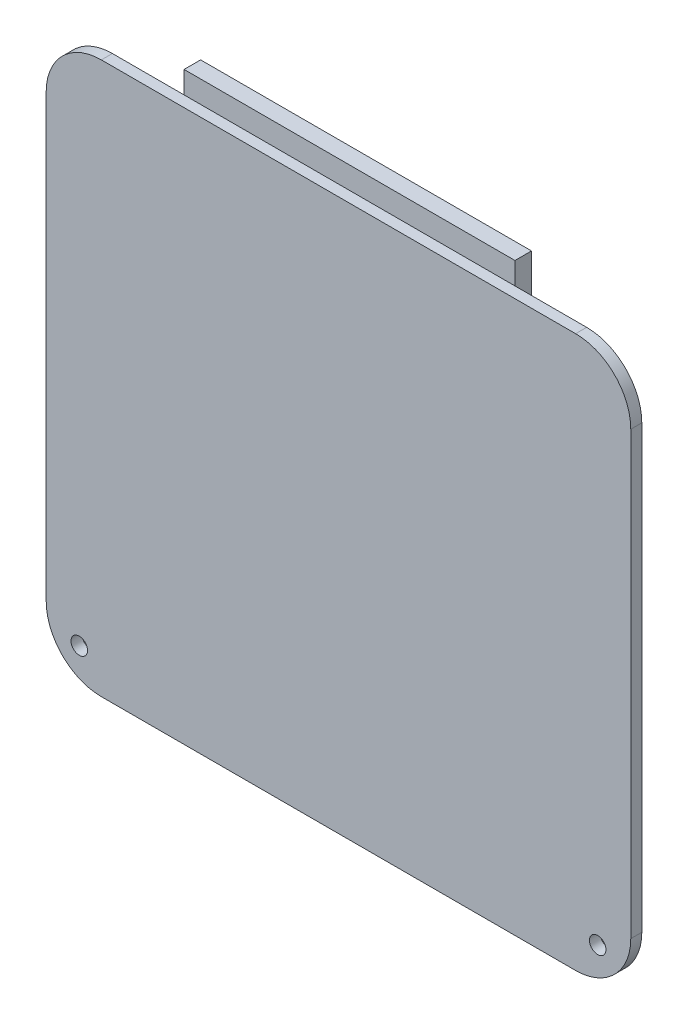
ISO-10303-21;
HEADER;
FILE_DESCRIPTION(('STEP AP214'),'2;1');
FILE_NAME('part.step','',(''),(''),'','','');
FILE_SCHEMA(('AUTOMOTIVE_DESIGN { 1 0 10303 214 1 1 1 1 }'));
ENDSEC;
DATA;
#1=APPLICATION_CONTEXT('core data for automotive mechanical design processes');
#2=APPLICATION_PROTOCOL_DEFINITION('international standard','automotive_design',2000,#1);
#3=PRODUCT_CONTEXT('',#1,'mechanical');
#4=PRODUCT('Part','Part','',(#3));
#5=PRODUCT_RELATED_PRODUCT_CATEGORY('part','',(#4));
#6=PRODUCT_DEFINITION_FORMATION('','',#4);
#7=PRODUCT_DEFINITION_CONTEXT('part definition',#1,'design');
#8=PRODUCT_DEFINITION('design','',#6,#7);
#9=PRODUCT_DEFINITION_SHAPE('','',#8);
#10=(LENGTH_UNIT() NAMED_UNIT(*) SI_UNIT(.MILLI.,.METRE.));
#11=(NAMED_UNIT(*) PLANE_ANGLE_UNIT() SI_UNIT($,.RADIAN.));
#12=(NAMED_UNIT(*) SI_UNIT($,.STERADIAN.) SOLID_ANGLE_UNIT());
#13=UNCERTAINTY_MEASURE_WITH_UNIT(LENGTH_MEASURE(1.E-05),#10,'distance_accuracy_value','');
#14=(GEOMETRIC_REPRESENTATION_CONTEXT(3) GLOBAL_UNCERTAINTY_ASSIGNED_CONTEXT((#13)) GLOBAL_UNIT_ASSIGNED_CONTEXT((#10,
#11,#12)) REPRESENTATION_CONTEXT('',''));
#15=CARTESIAN_POINT('',(0.,0.,0.));
#16=DIRECTION('',(0.,0.,1.));
#17=DIRECTION('',(1.,0.,0.));
#18=AXIS2_PLACEMENT_3D('',#15,#16,#17);
#19=CARTESIAN_POINT('',(-43.0000000000001,270.,-2.));
#20=DIRECTION('',(0.,0.,1.));
#21=DIRECTION('',(1.,0.,0.));
#22=AXIS2_PLACEMENT_3D('',#19,#20,#21);
#23=PLANE('',#22);
#24=CARTESIAN_POINT('',(-47.0000000000002,266.,-2.));
#25=DIRECTION('',(0.,0.,-1.));
#26=DIRECTION('',(1.,0.,0.));
#27=AXIS2_PLACEMENT_3D('',#24,#25,#26);
#28=CIRCLE('',#27,1.5);
#29=CARTESIAN_POINT('',(-45.5000000000002,266.,-2.));
#30=VERTEX_POINT('',#29);
#31=EDGE_CURVE('E167',#30,#30,#28,.T.);
#32=ORIENTED_EDGE('',*,*,#31,.F.);
#33=EDGE_LOOP('',(#32));
#34=FACE_BOUND('',#33,.T.);
#35=CARTESIAN_POINT('',(47.,266.,-2.));
#36=DIRECTION('',(0.,0.,-1.));
#37=DIRECTION('',(1.,0.,0.));
#38=AXIS2_PLACEMENT_3D('',#35,#36,#37);
#39=CIRCLE('',#38,1.5);
#40=CARTESIAN_POINT('',(48.5,266.,-2.));
#41=VERTEX_POINT('',#40);
#42=EDGE_CURVE('E170',#41,#41,#39,.T.);
#43=ORIENTED_EDGE('',*,*,#42,.F.);
#44=EDGE_LOOP('',(#43));
#45=FACE_BOUND('',#44,.T.);
#46=DIRECTION('',(-1.,0.,0.));
#47=VECTOR('',#46,1.);
#48=CARTESIAN_POINT('',(30.,348.25735931288,-2.));
#49=LINE('',#48,#47);
#50=CARTESIAN_POINT('',(-30.,348.25735931288,-2.));
#51=VERTEX_POINT('',#50);
#52=CARTESIAN_POINT('',(30.,348.25735931288,-2.));
#53=VERTEX_POINT('',#52);
#54=EDGE_CURVE('E255',#51,#53,#49,.F.);
#55=ORIENTED_EDGE('',*,*,#54,.T.);
#56=DIRECTION('',(0.,-1.,0.));
#57=VECTOR('',#56,1.);
#58=CARTESIAN_POINT('',(30.,352.5,-2.));
#59=LINE('',#58,#57);
#60=CARTESIAN_POINT('',(30.,360.,-2.));
#61=VERTEX_POINT('',#60);
#62=EDGE_CURVE('E232',#61,#53,#59,.T.);
#63=ORIENTED_EDGE('',*,*,#62,.F.);
#64=DIRECTION('',(-1.,0.,0.));
#65=VECTOR('',#64,1.);
#66=CARTESIAN_POINT('',(43.,360.,-2.));
#67=LINE('',#66,#65);
#68=CARTESIAN_POINT('',(43.,360.,-2.));
#69=VERTEX_POINT('',#68);
#70=EDGE_CURVE('E195',#69,#61,#67,.T.);
#71=ORIENTED_EDGE('',*,*,#70,.F.);
#72=CARTESIAN_POINT('',(43.,350.,-2.));
#73=DIRECTION('',(0.,0.,1.));
#74=DIRECTION('',(1.,0.,0.));
#75=AXIS2_PLACEMENT_3D('',#72,#73,#74);
#76=CIRCLE('',#75,10.);
#77=CARTESIAN_POINT('',(53.,350.,-2.));
#78=VERTEX_POINT('',#77);
#79=EDGE_CURVE('E191',#78,#69,#76,.T.);
#80=ORIENTED_EDGE('',*,*,#79,.F.);
#81=DIRECTION('',(0.,1.,0.));
#82=VECTOR('',#81,1.);
#83=CARTESIAN_POINT('',(53.,270.,-2.));
#84=LINE('',#83,#82);
#85=CARTESIAN_POINT('',(53.,270.,-2.));
#86=VERTEX_POINT('',#85);
#87=EDGE_CURVE('E188',#86,#78,#84,.T.);
#88=ORIENTED_EDGE('',*,*,#87,.F.);
#89=CARTESIAN_POINT('',(43.,270.,-2.));
#90=DIRECTION('',(0.,0.,1.));
#91=DIRECTION('',(1.,0.,0.));
#92=AXIS2_PLACEMENT_3D('',#89,#90,#91);
#93=CIRCLE('',#92,10.);
#94=CARTESIAN_POINT('',(43.,260.,-2.));
#95=VERTEX_POINT('',#94);
#96=EDGE_CURVE('E185',#95,#86,#93,.T.);
#97=ORIENTED_EDGE('',*,*,#96,.F.);
#98=DIRECTION('',(1.,0.,0.));
#99=VECTOR('',#98,1.);
#100=CARTESIAN_POINT('',(-43.0000000000001,260.,-2.));
#101=LINE('',#100,#99);
#102=CARTESIAN_POINT('',(-43.0000000000001,260.,-2.));
#103=VERTEX_POINT('',#102);
#104=EDGE_CURVE('E181',#103,#95,#101,.T.);
#105=ORIENTED_EDGE('',*,*,#104,.F.);
#106=CARTESIAN_POINT('',(-43.0000000000001,270.,-2.));
#107=DIRECTION('',(0.,0.,1.));
#108=DIRECTION('',(1.,0.,0.));
#109=AXIS2_PLACEMENT_3D('',#106,#107,#108);
#110=CIRCLE('',#109,10.);
#111=CARTESIAN_POINT('',(-53.0000000000001,270.,-2.));
#112=VERTEX_POINT('',#111);
#113=EDGE_CURVE('E178',#112,#103,#110,.T.);
#114=ORIENTED_EDGE('',*,*,#113,.F.);
#115=DIRECTION('',(0.,-1.,0.));
#116=VECTOR('',#115,1.);
#117=CARTESIAN_POINT('',(-53.0000000000001,350.,-2.));
#118=LINE('',#117,#116);
#119=CARTESIAN_POINT('',(-53.0000000000001,350.,-2.));
#120=VERTEX_POINT('',#119);
#121=EDGE_CURVE('E202',#120,#112,#118,.T.);
#122=ORIENTED_EDGE('',*,*,#121,.F.);
#123=CARTESIAN_POINT('',(-43.0000000000001,350.,-2.));
#124=DIRECTION('',(0.,0.,1.));
#125=DIRECTION('',(1.,0.,0.));
#126=AXIS2_PLACEMENT_3D('',#123,#124,#125);
#127=CIRCLE('',#126,10.);
#128=CARTESIAN_POINT('',(-43.0000000000001,360.,-2.));
#129=VERTEX_POINT('',#128);
#130=EDGE_CURVE('E198',#129,#120,#127,.T.);
#131=ORIENTED_EDGE('',*,*,#130,.F.);
#132=CARTESIAN_POINT('',(-30.,360.,-2.));
#133=VERTEX_POINT('',#132);
#134=EDGE_CURVE('E194',#133,#129,#67,.T.);
#135=ORIENTED_EDGE('',*,*,#134,.F.);
#136=DIRECTION('',(0.,1.,0.));
#137=VECTOR('',#136,1.);
#138=CARTESIAN_POINT('',(-30.,364.,-2.));
#139=LINE('',#138,#137);
#140=EDGE_CURVE('E276',#51,#133,#139,.T.);
#141=ORIENTED_EDGE('',*,*,#140,.F.);
#142=EDGE_LOOP('',(#55,#63,#71,#80,#88,#97,#105,#114,#122,#131,#135,#141));
#143=FACE_BOUND('',#142,.T.);
#144=ADVANCED_FACE('F35',(#34,#45,#143),#23,.F.);
#145=CARTESIAN_POINT('',(-43.0000000000001,270.,-2.));
#146=DIRECTION('',(0.,0.,1.));
#147=DIRECTION('',(1.,0.,0.));
#148=AXIS2_PLACEMENT_3D('',#145,#146,#147);
#149=CYLINDRICAL_SURFACE('',#148,10.);
#150=CARTESIAN_POINT('',(-43.0000000000001,270.,0.));
#151=DIRECTION('',(0.,0.,1.));
#152=DIRECTION('',(1.,0.,0.));
#153=AXIS2_PLACEMENT_3D('',#150,#151,#152);
#154=CIRCLE('',#153,10.);
#155=CARTESIAN_POINT('',(-53.0000000000001,270.,0.));
#156=VERTEX_POINT('',#155);
#157=CARTESIAN_POINT('',(-43.0000000000001,260.,0.));
#158=VERTEX_POINT('',#157);
#159=EDGE_CURVE('E206',#156,#158,#154,.T.);
#160=ORIENTED_EDGE('',*,*,#159,.F.);
#161=DIRECTION('',(0.,0.,1.));
#162=VECTOR('',#161,1.);
#163=CARTESIAN_POINT('',(-53.0000000000001,270.,-2.));
#164=LINE('',#163,#162);
#165=EDGE_CURVE('E230',#112,#156,#164,.T.);
#166=ORIENTED_EDGE('',*,*,#165,.F.);
#167=ORIENTED_EDGE('',*,*,#113,.T.);
#168=DIRECTION('',(0.,0.,1.));
#169=VECTOR('',#168,1.);
#170=CARTESIAN_POINT('',(-43.0000000000001,260.,-2.));
#171=LINE('',#170,#169);
#172=EDGE_CURVE('E205',#103,#158,#171,.T.);
#173=ORIENTED_EDGE('',*,*,#172,.T.);
#174=EDGE_LOOP('',(#160,#166,#167,#173));
#175=FACE_BOUND('',#174,.T.);
#176=ADVANCED_FACE('F282',(#175),#149,.T.);
#177=CARTESIAN_POINT('',(-53.0000000000001,350.,-2.));
#178=DIRECTION('',(-1.,0.,0.));
#179=DIRECTION('',(0.,-1.,0.));
#180=AXIS2_PLACEMENT_3D('',#177,#178,#179);
#181=PLANE('',#180);
#182=DIRECTION('',(0.,-1.,0.));
#183=VECTOR('',#182,1.);
#184=CARTESIAN_POINT('',(-53.0000000000001,350.,0.));
#185=LINE('',#184,#183);
#186=CARTESIAN_POINT('',(-53.0000000000001,350.,0.));
#187=VERTEX_POINT('',#186);
#188=EDGE_CURVE('E182',#187,#156,#185,.T.);
#189=ORIENTED_EDGE('',*,*,#188,.F.);
#190=DIRECTION('',(0.,0.,1.));
#191=VECTOR('',#190,1.);
#192=CARTESIAN_POINT('',(-53.0000000000001,350.,-2.));
#193=LINE('',#192,#191);
#194=EDGE_CURVE('E233',#120,#187,#193,.T.);
#195=ORIENTED_EDGE('',*,*,#194,.F.);
#196=ORIENTED_EDGE('',*,*,#121,.T.);
#197=ORIENTED_EDGE('',*,*,#165,.T.);
#198=EDGE_LOOP('',(#189,#195,#196,#197));
#199=FACE_BOUND('',#198,.T.);
#200=ADVANCED_FACE('F290',(#199),#181,.T.);
#201=CARTESIAN_POINT('',(-43.0000000000001,350.,-2.));
#202=DIRECTION('',(0.,0.,1.));
#203=DIRECTION('',(1.,0.,0.));
#204=AXIS2_PLACEMENT_3D('',#201,#202,#203);
#205=CYLINDRICAL_SURFACE('',#204,10.);
#206=CARTESIAN_POINT('',(-43.0000000000001,350.,0.));
#207=DIRECTION('',(0.,0.,1.));
#208=DIRECTION('',(1.,0.,0.));
#209=AXIS2_PLACEMENT_3D('',#206,#207,#208);
#210=CIRCLE('',#209,10.);
#211=CARTESIAN_POINT('',(-43.0000000000001,360.,0.));
#212=VERTEX_POINT('',#211);
#213=EDGE_CURVE('E225',#212,#187,#210,.T.);
#214=ORIENTED_EDGE('',*,*,#213,.F.);
#215=DIRECTION('',(0.,0.,1.));
#216=VECTOR('',#215,1.);
#217=CARTESIAN_POINT('',(-43.0000000000001,360.,-2.));
#218=LINE('',#217,#216);
#219=EDGE_CURVE('E235',#129,#212,#218,.T.);
#220=ORIENTED_EDGE('',*,*,#219,.F.);
#221=ORIENTED_EDGE('',*,*,#130,.T.);
#222=ORIENTED_EDGE('',*,*,#194,.T.);
#223=EDGE_LOOP('',(#214,#220,#221,#222));
#224=FACE_BOUND('',#223,.T.);
#225=ADVANCED_FACE('F306',(#224),#205,.T.);
#226=CARTESIAN_POINT('',(43.,360.,-2.));
#227=DIRECTION('',(0.,1.,0.));
#228=DIRECTION('',(0.,0.,1.));
#229=AXIS2_PLACEMENT_3D('',#226,#227,#228);
#230=PLANE('',#229);
#231=DIRECTION('',(-1.,0.,0.));
#232=VECTOR('',#231,1.);
#233=CARTESIAN_POINT('',(43.,360.,0.));
#234=LINE('',#233,#232);
#235=CARTESIAN_POINT('',(43.,360.,0.));
#236=VERTEX_POINT('',#235);
#237=EDGE_CURVE('E222',#236,#212,#234,.T.);
#238=ORIENTED_EDGE('',*,*,#237,.F.);
#239=DIRECTION('',(0.,0.,1.));
#240=VECTOR('',#239,1.);
#241=CARTESIAN_POINT('',(43.,360.,-2.));
#242=LINE('',#241,#240);
#243=EDGE_CURVE('E237',#69,#236,#242,.T.);
#244=ORIENTED_EDGE('',*,*,#243,.F.);
#245=ORIENTED_EDGE('',*,*,#70,.T.);
#246=EDGE_CURVE('E199',#61,#133,#67,.T.);
#247=ORIENTED_EDGE('',*,*,#246,.T.);
#248=ORIENTED_EDGE('',*,*,#134,.T.);
#249=ORIENTED_EDGE('',*,*,#219,.T.);
#250=EDGE_LOOP('',(#238,#244,#245,#247,#248,#249));
#251=FACE_BOUND('',#250,.T.);
#252=ADVANCED_FACE('F310',(#251),#230,.T.);
#253=CARTESIAN_POINT('',(43.,350.,-2.));
#254=DIRECTION('',(0.,0.,1.));
#255=DIRECTION('',(1.,0.,0.));
#256=AXIS2_PLACEMENT_3D('',#253,#254,#255);
#257=CYLINDRICAL_SURFACE('',#256,10.);
#258=CARTESIAN_POINT('',(43.,350.,0.));
#259=DIRECTION('',(0.,0.,1.));
#260=DIRECTION('',(1.,0.,0.));
#261=AXIS2_PLACEMENT_3D('',#258,#259,#260);
#262=CIRCLE('',#261,10.);
#263=CARTESIAN_POINT('',(53.,350.,0.));
#264=VERTEX_POINT('',#263);
#265=EDGE_CURVE('E219',#264,#236,#262,.T.);
#266=ORIENTED_EDGE('',*,*,#265,.F.);
#267=DIRECTION('',(0.,0.,1.));
#268=VECTOR('',#267,1.);
#269=CARTESIAN_POINT('',(53.,350.,-2.));
#270=LINE('',#269,#268);
#271=EDGE_CURVE('E239',#78,#264,#270,.T.);
#272=ORIENTED_EDGE('',*,*,#271,.F.);
#273=ORIENTED_EDGE('',*,*,#79,.T.);
#274=ORIENTED_EDGE('',*,*,#243,.T.);
#275=EDGE_LOOP('',(#266,#272,#273,#274));
#276=FACE_BOUND('',#275,.T.);
#277=ADVANCED_FACE('F314',(#276),#257,.T.);
#278=CARTESIAN_POINT('',(53.,270.,-2.));
#279=DIRECTION('',(1.,0.,0.));
#280=DIRECTION('',(0.,1.,0.));
#281=AXIS2_PLACEMENT_3D('',#278,#279,#280);
#282=PLANE('',#281);
#283=DIRECTION('',(0.,1.,0.));
#284=VECTOR('',#283,1.);
#285=CARTESIAN_POINT('',(53.,270.,0.));
#286=LINE('',#285,#284);
#287=CARTESIAN_POINT('',(53.,270.,0.));
#288=VERTEX_POINT('',#287);
#289=EDGE_CURVE('E216',#288,#264,#286,.T.);
#290=ORIENTED_EDGE('',*,*,#289,.F.);
#291=DIRECTION('',(0.,0.,1.));
#292=VECTOR('',#291,1.);
#293=CARTESIAN_POINT('',(53.,270.,-2.));
#294=LINE('',#293,#292);
#295=EDGE_CURVE('E241',#86,#288,#294,.T.);
#296=ORIENTED_EDGE('',*,*,#295,.F.);
#297=ORIENTED_EDGE('',*,*,#87,.T.);
#298=ORIENTED_EDGE('',*,*,#271,.T.);
#299=EDGE_LOOP('',(#290,#296,#297,#298));
#300=FACE_BOUND('',#299,.T.);
#301=ADVANCED_FACE('F318',(#300),#282,.T.);
#302=CARTESIAN_POINT('',(43.,270.,-2.));
#303=DIRECTION('',(0.,0.,1.));
#304=DIRECTION('',(1.,0.,0.));
#305=AXIS2_PLACEMENT_3D('',#302,#303,#304);
#306=CYLINDRICAL_SURFACE('',#305,10.);
#307=CARTESIAN_POINT('',(43.,270.,0.));
#308=DIRECTION('',(0.,0.,1.));
#309=DIRECTION('',(1.,0.,0.));
#310=AXIS2_PLACEMENT_3D('',#307,#308,#309);
#311=CIRCLE('',#310,10.);
#312=CARTESIAN_POINT('',(43.,260.,0.));
#313=VERTEX_POINT('',#312);
#314=EDGE_CURVE('E213',#313,#288,#311,.T.);
#315=ORIENTED_EDGE('',*,*,#314,.F.);
#316=DIRECTION('',(0.,0.,1.));
#317=VECTOR('',#316,1.);
#318=CARTESIAN_POINT('',(43.,260.,-2.));
#319=LINE('',#318,#317);
#320=EDGE_CURVE('E243',#95,#313,#319,.T.);
#321=ORIENTED_EDGE('',*,*,#320,.F.);
#322=ORIENTED_EDGE('',*,*,#96,.T.);
#323=ORIENTED_EDGE('',*,*,#295,.T.);
#324=EDGE_LOOP('',(#315,#321,#322,#323));
#325=FACE_BOUND('',#324,.T.);
#326=ADVANCED_FACE('F322',(#325),#306,.T.);
#327=CARTESIAN_POINT('',(-43.0000000000001,260.,-2.));
#328=DIRECTION('',(0.,-1.,0.));
#329=DIRECTION('',(0.,0.,-1.));
#330=AXIS2_PLACEMENT_3D('',#327,#328,#329);
#331=PLANE('',#330);
#332=DIRECTION('',(1.,0.,0.));
#333=VECTOR('',#332,1.);
#334=CARTESIAN_POINT('',(-43.0000000000001,260.,0.));
#335=LINE('',#334,#333);
#336=EDGE_CURVE('E209',#158,#313,#335,.T.);
#337=ORIENTED_EDGE('',*,*,#336,.F.);
#338=ORIENTED_EDGE('',*,*,#172,.F.);
#339=ORIENTED_EDGE('',*,*,#104,.T.);
#340=ORIENTED_EDGE('',*,*,#320,.T.);
#341=EDGE_LOOP('',(#337,#338,#339,#340));
#342=FACE_BOUND('',#341,.T.);
#343=ADVANCED_FACE('F302',(#342),#331,.T.);
#344=CARTESIAN_POINT('',(-43.0000000000001,270.,0.));
#345=DIRECTION('',(0.,0.,1.));
#346=DIRECTION('',(1.,0.,0.));
#347=AXIS2_PLACEMENT_3D('',#344,#345,#346);
#348=PLANE('',#347);
#349=CARTESIAN_POINT('',(47.,266.,0.));
#350=DIRECTION('',(0.,0.,1.));
#351=DIRECTION('',(1.,0.,0.));
#352=AXIS2_PLACEMENT_3D('',#349,#350,#351);
#353=CIRCLE('',#352,1.5);
#354=CARTESIAN_POINT('',(48.5,266.,0.));
#355=VERTEX_POINT('',#354);
#356=EDGE_CURVE('E210',#355,#355,#353,.T.);
#357=ORIENTED_EDGE('',*,*,#356,.F.);
#358=EDGE_LOOP('',(#357));
#359=FACE_BOUND('',#358,.T.);
#360=CARTESIAN_POINT('',(-47.0000000000002,266.,0.));
#361=DIRECTION('',(0.,0.,1.));
#362=DIRECTION('',(1.,0.,0.));
#363=AXIS2_PLACEMENT_3D('',#360,#361,#362);
#364=CIRCLE('',#363,1.5);
#365=CARTESIAN_POINT('',(-45.5000000000002,266.,0.));
#366=VERTEX_POINT('',#365);
#367=EDGE_CURVE('E176',#366,#366,#364,.T.);
#368=ORIENTED_EDGE('',*,*,#367,.F.);
#369=EDGE_LOOP('',(#368));
#370=FACE_BOUND('',#369,.T.);
#371=ORIENTED_EDGE('',*,*,#159,.T.);
#372=ORIENTED_EDGE('',*,*,#336,.T.);
#373=ORIENTED_EDGE('',*,*,#314,.T.);
#374=ORIENTED_EDGE('',*,*,#289,.T.);
#375=ORIENTED_EDGE('',*,*,#265,.T.);
#376=ORIENTED_EDGE('',*,*,#237,.T.);
#377=ORIENTED_EDGE('',*,*,#213,.T.);
#378=ORIENTED_EDGE('',*,*,#188,.T.);
#379=EDGE_LOOP('',(#371,#372,#373,#374,#375,#376,#377,#378));
#380=FACE_BOUND('',#379,.T.);
#381=ADVANCED_FACE('F299',(#359,#370,#380),#348,.T.);
#382=CARTESIAN_POINT('',(-47.0000000000002,266.,1.));
#383=DIRECTION('',(0.,0.,-1.));
#384=DIRECTION('',(-1.,0.,0.));
#385=AXIS2_PLACEMENT_3D('',#382,#383,#384);
#386=CYLINDRICAL_SURFACE('',#385,1.5);
#387=ORIENTED_EDGE('',*,*,#367,.T.);
#388=EDGE_LOOP('',(#387));
#389=FACE_BOUND('',#388,.T.);
#390=ORIENTED_EDGE('',*,*,#31,.T.);
#391=EDGE_LOOP('',(#390));
#392=FACE_BOUND('',#391,.T.);
#393=ADVANCED_FACE('F297',(#389,#392),#386,.F.);
#394=CARTESIAN_POINT('',(47.,266.,1.));
#395=DIRECTION('',(0.,0.,-1.));
#396=DIRECTION('',(-1.,0.,0.));
#397=AXIS2_PLACEMENT_3D('',#394,#395,#396);
#398=CYLINDRICAL_SURFACE('',#397,1.5);
#399=ORIENTED_EDGE('',*,*,#356,.T.);
#400=EDGE_LOOP('',(#399));
#401=FACE_BOUND('',#400,.T.);
#402=ORIENTED_EDGE('',*,*,#42,.T.);
#403=EDGE_LOOP('',(#402));
#404=FACE_BOUND('',#403,.T.);
#405=ADVANCED_FACE('F345',(#401,#404),#398,.F.);
#406=CARTESIAN_POINT('',(0.,0.,-2.));
#407=DIRECTION('',(0.,0.,1.));
#408=DIRECTION('',(1.,0.,0.));
#409=AXIS2_PLACEMENT_3D('',#406,#407,#408);
#410=PLANE('',#409);
#411=ORIENTED_EDGE('',*,*,#246,.F.);
#412=CARTESIAN_POINT('',(30.,364.,-2.));
#413=VERTEX_POINT('',#412);
#414=EDGE_CURVE('E152',#413,#61,#59,.T.);
#415=ORIENTED_EDGE('',*,*,#414,.F.);
#416=DIRECTION('',(1.,0.,0.));
#417=VECTOR('',#416,1.);
#418=CARTESIAN_POINT('',(30.,364.,-2.));
#419=LINE('',#418,#417);
#420=CARTESIAN_POINT('',(-30.,364.,-2.));
#421=VERTEX_POINT('',#420);
#422=EDGE_CURVE('E364',#421,#413,#419,.T.);
#423=ORIENTED_EDGE('',*,*,#422,.F.);
#424=EDGE_CURVE('E165',#133,#421,#139,.T.);
#425=ORIENTED_EDGE('',*,*,#424,.F.);
#426=EDGE_LOOP('',(#411,#415,#423,#425));
#427=FACE_BOUND('',#426,.T.);
#428=ADVANCED_FACE('F343',(#427),#410,.T.);
#429=CARTESIAN_POINT('',(-30.,364.,-5.));
#430=DIRECTION('',(1.,0.,0.));
#431=DIRECTION('',(0.,1.,0.));
#432=AXIS2_PLACEMENT_3D('',#429,#430,#431);
#433=PLANE('',#432);
#434=DIRECTION('',(0.,1.,0.));
#435=VECTOR('',#434,1.);
#436=CARTESIAN_POINT('',(-30.,364.,-5.));
#437=LINE('',#436,#435);
#438=CARTESIAN_POINT('',(-30.,353.742640687119,-5.));
#439=VERTEX_POINT('',#438);
#440=CARTESIAN_POINT('',(-30.,364.,-5.));
#441=VERTEX_POINT('',#440);
#442=EDGE_CURVE('E144',#439,#441,#437,.T.);
#443=ORIENTED_EDGE('',*,*,#442,.F.);
#444=CARTESIAN_POINT('',(-30.,353.742640687119,-2.));
#445=DIRECTION('',(1.,0.,0.));
#446=DIRECTION('',(0.,1.,0.));
#447=AXIS2_PLACEMENT_3D('',#444,#445,#446);
#448=CIRCLE('',#447,3.);
#449=CARTESIAN_POINT('',(-30.,351.621320343559,-4.12132034355964));
#450=VERTEX_POINT('',#449);
#451=EDGE_CURVE('E58',#439,#450,#448,.F.);
#452=ORIENTED_EDGE('',*,*,#451,.T.);
#453=DIRECTION('',(0.,0.707106781186548,-0.707106781186547));
#454=VECTOR('',#453,1.);
#455=CARTESIAN_POINT('',(-30.,358.25,-10.75));
#456=LINE('',#455,#454);
#457=CARTESIAN_POINT('',(-30.,350.37867965644,-2.87867965644033));
#458=VERTEX_POINT('',#457);
#459=EDGE_CURVE('E250',#450,#458,#456,.F.);
#460=ORIENTED_EDGE('',*,*,#459,.T.);
#461=CARTESIAN_POINT('',(-30.,348.25735931288,-5.));
#462=DIRECTION('',(1.,0.,0.));
#463=DIRECTION('',(0.,1.,0.));
#464=AXIS2_PLACEMENT_3D('',#461,#462,#463);
#465=CIRCLE('',#464,3.);
#466=EDGE_CURVE('E11',#458,#51,#465,.T.);
#467=ORIENTED_EDGE('',*,*,#466,.T.);
#468=ORIENTED_EDGE('',*,*,#140,.T.);
#469=ORIENTED_EDGE('',*,*,#424,.T.);
#470=DIRECTION('',(0.,0.,1.));
#471=VECTOR('',#470,1.);
#472=CARTESIAN_POINT('',(-30.,364.,-5.));
#473=LINE('',#472,#471);
#474=EDGE_CURVE('E157',#441,#421,#473,.T.);
#475=ORIENTED_EDGE('',*,*,#474,.F.);
#476=EDGE_LOOP('',(#443,#452,#460,#467,#468,#469,#475));
#477=FACE_BOUND('',#476,.T.);
#478=ADVANCED_FACE('F162',(#477),#433,.F.);
#479=CARTESIAN_POINT('',(30.,364.,-5.));
#480=DIRECTION('',(0.,-1.,0.));
#481=DIRECTION('',(0.,0.,-1.));
#482=AXIS2_PLACEMENT_3D('',#479,#480,#481);
#483=PLANE('',#482);
#484=ORIENTED_EDGE('',*,*,#422,.T.);
#485=DIRECTION('',(0.,0.,1.));
#486=VECTOR('',#485,1.);
#487=CARTESIAN_POINT('',(30.,364.,-5.));
#488=LINE('',#487,#486);
#489=CARTESIAN_POINT('',(30.,364.,-5.));
#490=VERTEX_POINT('',#489);
#491=EDGE_CURVE('E159',#490,#413,#488,.T.);
#492=ORIENTED_EDGE('',*,*,#491,.F.);
#493=DIRECTION('',(1.,0.,0.));
#494=VECTOR('',#493,1.);
#495=CARTESIAN_POINT('',(30.,364.,-5.));
#496=LINE('',#495,#494);
#497=EDGE_CURVE('E147',#441,#490,#496,.T.);
#498=ORIENTED_EDGE('',*,*,#497,.F.);
#499=ORIENTED_EDGE('',*,*,#474,.T.);
#500=EDGE_LOOP('',(#484,#492,#498,#499));
#501=FACE_BOUND('',#500,.T.);
#502=ADVANCED_FACE('F156',(#501),#483,.F.);
#503=CARTESIAN_POINT('',(30.,352.5,-5.));
#504=DIRECTION('',(-1.,0.,0.));
#505=DIRECTION('',(0.,0.,1.));
#506=AXIS2_PLACEMENT_3D('',#503,#504,#505);
#507=PLANE('',#506);
#508=DIRECTION('',(0.,-0.707106781186548,0.707106781186547));
#509=VECTOR('',#508,1.);
#510=CARTESIAN_POINT('',(30.,352.5,-5.));
#511=LINE('',#510,#509);
#512=CARTESIAN_POINT('',(30.,350.37867965644,-2.87867965644034));
#513=VERTEX_POINT('',#512);
#514=CARTESIAN_POINT('',(30.,351.621320343559,-4.12132034355965));
#515=VERTEX_POINT('',#514);
#516=EDGE_CURVE('E253',#513,#515,#511,.F.);
#517=ORIENTED_EDGE('',*,*,#516,.T.);
#518=CARTESIAN_POINT('',(30.,353.742640687119,-2.));
#519=DIRECTION('',(-1.,0.,0.));
#520=DIRECTION('',(0.,0.,1.));
#521=AXIS2_PLACEMENT_3D('',#518,#519,#520);
#522=CIRCLE('',#521,3.);
#523=CARTESIAN_POINT('',(30.,353.742640687119,-5.));
#524=VERTEX_POINT('',#523);
#525=EDGE_CURVE('E50',#515,#524,#522,.F.);
#526=ORIENTED_EDGE('',*,*,#525,.T.);
#527=DIRECTION('',(0.,-1.,0.));
#528=VECTOR('',#527,1.);
#529=CARTESIAN_POINT('',(30.,352.5,-5.));
#530=LINE('',#529,#528);
#531=EDGE_CURVE('E160',#490,#524,#530,.T.);
#532=ORIENTED_EDGE('',*,*,#531,.F.);
#533=ORIENTED_EDGE('',*,*,#491,.T.);
#534=ORIENTED_EDGE('',*,*,#414,.T.);
#535=ORIENTED_EDGE('',*,*,#62,.T.);
#536=CARTESIAN_POINT('',(30.,348.25735931288,-5.));
#537=DIRECTION('',(-1.,0.,0.));
#538=DIRECTION('',(0.,0.,1.));
#539=AXIS2_PLACEMENT_3D('',#536,#537,#538);
#540=CIRCLE('',#539,3.);
#541=EDGE_CURVE('E43',#53,#513,#540,.T.);
#542=ORIENTED_EDGE('',*,*,#541,.T.);
#543=EDGE_LOOP('',(#517,#526,#532,#533,#534,#535,#542));
#544=FACE_BOUND('',#543,.T.);
#545=ADVANCED_FACE('F266',(#544),#507,.F.);
#546=CARTESIAN_POINT('',(0.,0.,-5.));
#547=DIRECTION('',(0.,0.,1.));
#548=DIRECTION('',(1.,0.,0.));
#549=AXIS2_PLACEMENT_3D('',#546,#547,#548);
#550=PLANE('',#549);
#551=ORIENTED_EDGE('',*,*,#531,.T.);
#552=DIRECTION('',(1.,0.,0.));
#553=VECTOR('',#552,1.);
#554=CARTESIAN_POINT('',(0.,353.742640687119,-5.));
#555=LINE('',#554,#553);
#556=EDGE_CURVE('E149',#524,#439,#555,.F.);
#557=ORIENTED_EDGE('',*,*,#556,.T.);
#558=ORIENTED_EDGE('',*,*,#442,.T.);
#559=ORIENTED_EDGE('',*,*,#497,.T.);
#560=EDGE_LOOP('',(#551,#557,#558,#559));
#561=FACE_BOUND('',#560,.T.);
#562=ADVANCED_FACE('F146',(#561),#550,.F.);
#563=CARTESIAN_POINT('',(-30.,352.5,-5.));
#564=DIRECTION('',(0.,-0.707106781186547,-0.707106781186548));
#565=DIRECTION('',(1.,0.,0.));
#566=AXIS2_PLACEMENT_3D('',#563,#564,#565);
#567=PLANE('',#566);
#568=ORIENTED_EDGE('',*,*,#516,.F.);
#569=DIRECTION('',(1.,0.,0.));
#570=VECTOR('',#569,1.);
#571=CARTESIAN_POINT('',(-30.,350.37867965644,-2.87867965644034));
#572=LINE('',#571,#570);
#573=EDGE_CURVE('E260',#513,#458,#572,.F.);
#574=ORIENTED_EDGE('',*,*,#573,.T.);
#575=ORIENTED_EDGE('',*,*,#459,.F.);
#576=DIRECTION('',(-1.,0.,0.));
#577=VECTOR('',#576,1.);
#578=CARTESIAN_POINT('',(-30.,351.621320343559,-4.12132034355965));
#579=LINE('',#578,#577);
#580=EDGE_CURVE('E258',#450,#515,#579,.F.);
#581=ORIENTED_EDGE('',*,*,#580,.T.);
#582=EDGE_LOOP('',(#568,#574,#575,#581));
#583=FACE_BOUND('',#582,.T.);
#584=ADVANCED_FACE('F272',(#583),#567,.T.);
#585=CARTESIAN_POINT('',(-43.0000000000001,348.25735931288,-5.));
#586=DIRECTION('',(1.,0.,0.));
#587=DIRECTION('',(0.,0.,-1.));
#588=AXIS2_PLACEMENT_3D('',#585,#586,#587);
#589=CYLINDRICAL_SURFACE('',#588,3.);
#590=ORIENTED_EDGE('',*,*,#466,.F.);
#591=ORIENTED_EDGE('',*,*,#573,.F.);
#592=ORIENTED_EDGE('',*,*,#541,.F.);
#593=ORIENTED_EDGE('',*,*,#54,.F.);
#594=EDGE_LOOP('',(#590,#591,#592,#593));
#595=FACE_BOUND('',#594,.T.);
#596=ADVANCED_FACE('F275',(#595),#589,.F.);
#597=CARTESIAN_POINT('',(0.,353.742640687119,-2.));
#598=DIRECTION('',(1.,0.,0.));
#599=DIRECTION('',(0.,0.,-1.));
#600=AXIS2_PLACEMENT_3D('',#597,#598,#599);
#601=CYLINDRICAL_SURFACE('',#600,3.);
#602=ORIENTED_EDGE('',*,*,#525,.F.);
#603=ORIENTED_EDGE('',*,*,#580,.F.);
#604=ORIENTED_EDGE('',*,*,#451,.F.);
#605=ORIENTED_EDGE('',*,*,#556,.F.);
#606=EDGE_LOOP('',(#602,#603,#604,#605));
#607=FACE_BOUND('',#606,.T.);
#608=ADVANCED_FACE('F37',(#607),#601,.T.);
#609=CLOSED_SHELL('',(#144,#176,#200,#225,#252,#277,#301,#326,#343,#381,#393,#405,#428,#478,
#502,#545,#562,#584,#596,#608));
#610=MANIFOLD_SOLID_BREP('B2',#609);
#611=ADVANCED_BREP_SHAPE_REPRESENTATION('',(#18,#610),#14);
#612=SHAPE_DEFINITION_REPRESENTATION(#9,#611);
ENDSEC;
END-ISO-10303-21;
